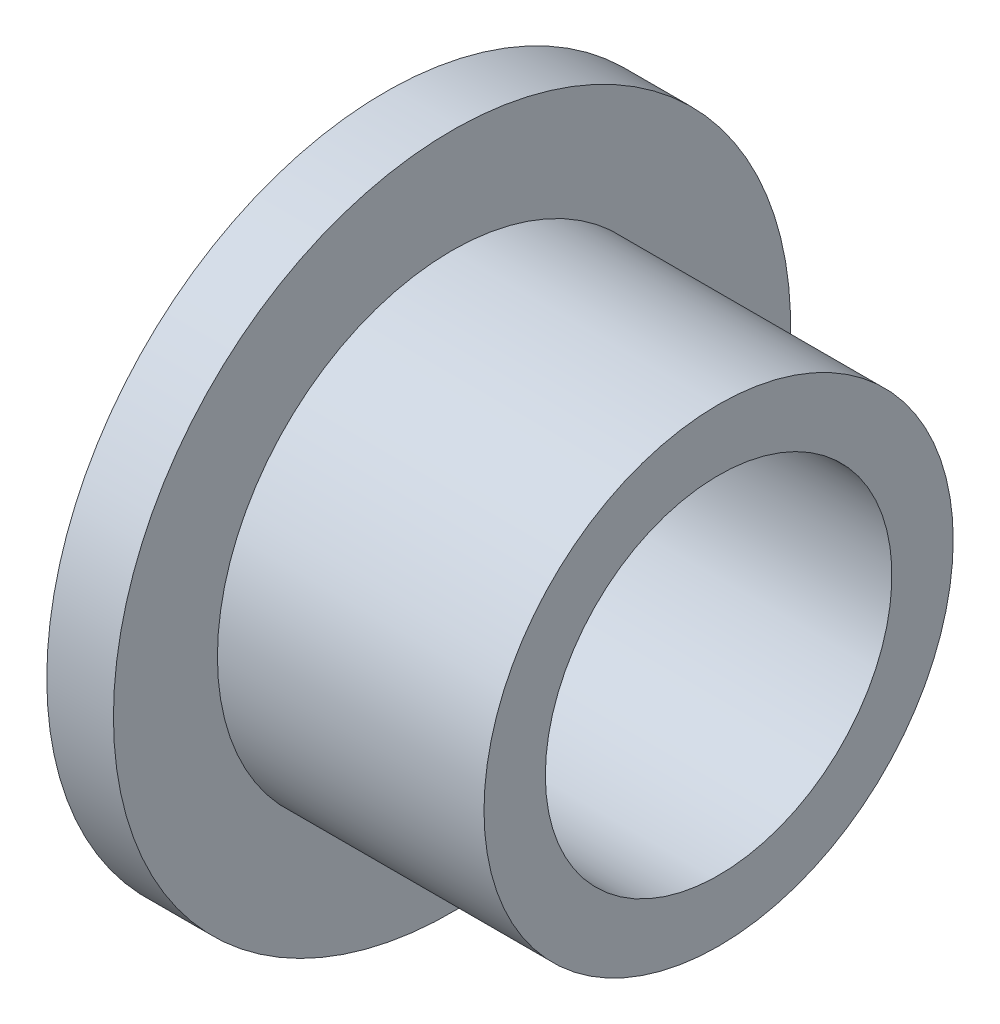
ISO-10303-21;
HEADER;
FILE_DESCRIPTION(('STEP AP214'),'2;1');
FILE_NAME('part.step','',(''),(''),'','','');
FILE_SCHEMA(('AUTOMOTIVE_DESIGN { 1 0 10303 214 1 1 1 1 }'));
ENDSEC;
DATA;
#1=APPLICATION_CONTEXT('core data for automotive mechanical design processes');
#2=APPLICATION_PROTOCOL_DEFINITION('international standard','automotive_design',2000,#1);
#3=PRODUCT_CONTEXT('',#1,'mechanical');
#4=PRODUCT('Part','Part','',(#3));
#5=PRODUCT_RELATED_PRODUCT_CATEGORY('part','',(#4));
#6=PRODUCT_DEFINITION_FORMATION('','',#4);
#7=PRODUCT_DEFINITION_CONTEXT('part definition',#1,'design');
#8=PRODUCT_DEFINITION('design','',#6,#7);
#9=PRODUCT_DEFINITION_SHAPE('','',#8);
#10=(LENGTH_UNIT() NAMED_UNIT(*) SI_UNIT(.MILLI.,.METRE.));
#11=(NAMED_UNIT(*) PLANE_ANGLE_UNIT() SI_UNIT($,.RADIAN.));
#12=(NAMED_UNIT(*) SI_UNIT($,.STERADIAN.) SOLID_ANGLE_UNIT());
#13=UNCERTAINTY_MEASURE_WITH_UNIT(LENGTH_MEASURE(1.E-05),#10,'distance_accuracy_value','');
#14=(GEOMETRIC_REPRESENTATION_CONTEXT(3) GLOBAL_UNCERTAINTY_ASSIGNED_CONTEXT((#13)) GLOBAL_UNIT_ASSIGNED_CONTEXT((#10,
#11,#12)) REPRESENTATION_CONTEXT('',''));
#15=CARTESIAN_POINT('',(0.,0.,0.));
#16=DIRECTION('',(0.,0.,1.));
#17=DIRECTION('',(1.,0.,0.));
#18=AXIS2_PLACEMENT_3D('',#15,#16,#17);
#19=CARTESIAN_POINT('',(-2.57532768734378,0.,0.));
#20=DIRECTION('',(-1.,0.,0.));
#21=DIRECTION('',(0.,0.,1.));
#22=AXIS2_PLACEMENT_3D('',#19,#20,#21);
#23=CYLINDRICAL_SURFACE('',#22,2.70605326876513);
#24=CARTESIAN_POINT('',(-2.57532768734378,0.,0.));
#25=DIRECTION('',(-1.,0.,0.));
#26=DIRECTION('',(0.,0.,1.));
#27=AXIS2_PLACEMENT_3D('',#24,#25,#26);
#28=CIRCLE('',#27,2.70605326876513);
#29=CARTESIAN_POINT('',(-2.57532768734378,0.,2.70605326876513));
#30=VERTEX_POINT('',#29);
#31=EDGE_CURVE('E10',#30,#30,#28,.T.);
#32=ORIENTED_EDGE('',*,*,#31,.T.);
#33=EDGE_LOOP('',(#32));
#34=FACE_BOUND('',#33,.T.);
#35=CARTESIAN_POINT('',(-5.65038822003143,0.,0.));
#36=DIRECTION('',(-1.,0.,0.));
#37=DIRECTION('',(0.,0.,1.));
#38=AXIS2_PLACEMENT_3D('',#35,#36,#37);
#39=CIRCLE('',#38,2.70605326876513);
#40=CARTESIAN_POINT('',(-5.65038822003143,0.,2.70605326876513));
#41=VERTEX_POINT('',#40);
#42=EDGE_CURVE('E57',#41,#41,#39,.T.);
#43=ORIENTED_EDGE('',*,*,#42,.F.);
#44=EDGE_LOOP('',(#43));
#45=FACE_BOUND('',#44,.T.);
#46=ADVANCED_FACE('F35',(#34,#45),#23,.T.);
#47=CARTESIAN_POINT('',(-2.57532768734378,2.70605326876513,0.));
#48=DIRECTION('',(1.,0.,0.));
#49=DIRECTION('',(0.,0.,-1.));
#50=AXIS2_PLACEMENT_3D('',#47,#48,#49);
#51=PLANE('',#50);
#52=CARTESIAN_POINT('',(-2.57532768734378,0.,0.));
#53=DIRECTION('',(-1.,0.,0.));
#54=DIRECTION('',(0.,0.,1.));
#55=AXIS2_PLACEMENT_3D('',#52,#53,#54);
#56=CIRCLE('',#55,1.99878934624697);
#57=CARTESIAN_POINT('',(-2.57532768734378,0.,1.99878934624697));
#58=VERTEX_POINT('',#57);
#59=EDGE_CURVE('E41',#58,#58,#56,.T.);
#60=ORIENTED_EDGE('',*,*,#59,.T.);
#61=EDGE_LOOP('',(#60));
#62=FACE_BOUND('',#61,.T.);
#63=ORIENTED_EDGE('',*,*,#31,.F.);
#64=EDGE_LOOP('',(#63));
#65=FACE_BOUND('',#64,.T.);
#66=ADVANCED_FACE('F65',(#62,#65),#51,.T.);
#67=CARTESIAN_POINT('',(-2.57532768734378,0.,0.));
#68=DIRECTION('',(-1.,0.,0.));
#69=DIRECTION('',(0.,0.,1.));
#70=AXIS2_PLACEMENT_3D('',#67,#68,#69);
#71=CYLINDRICAL_SURFACE('',#70,1.99878934624697);
#72=CARTESIAN_POINT('',(-6.41915335320334,0.,0.));
#73=DIRECTION('',(-1.,0.,0.));
#74=DIRECTION('',(0.,0.,1.));
#75=AXIS2_PLACEMENT_3D('',#72,#73,#74);
#76=CIRCLE('',#75,1.99878934624697);
#77=CARTESIAN_POINT('',(-6.41915335320334,0.,1.99878934624697));
#78=VERTEX_POINT('',#77);
#79=EDGE_CURVE('E45',#78,#78,#76,.T.);
#80=ORIENTED_EDGE('',*,*,#79,.T.);
#81=EDGE_LOOP('',(#80));
#82=FACE_BOUND('',#81,.T.);
#83=ORIENTED_EDGE('',*,*,#59,.F.);
#84=EDGE_LOOP('',(#83));
#85=FACE_BOUND('',#84,.T.);
#86=ADVANCED_FACE('F69',(#82,#85),#71,.F.);
#87=CARTESIAN_POINT('',(-6.41915335320334,1.99878934624697,0.));
#88=DIRECTION('',(-1.,0.,0.));
#89=DIRECTION('',(0.,0.,1.));
#90=AXIS2_PLACEMENT_3D('',#87,#88,#89);
#91=PLANE('',#90);
#92=CARTESIAN_POINT('',(-6.41915335320334,0.,0.));
#93=DIRECTION('',(-1.,0.,0.));
#94=DIRECTION('',(0.,0.,1.));
#95=AXIS2_PLACEMENT_3D('',#92,#93,#94);
#96=CIRCLE('',#95,3.90532687651332);
#97=CARTESIAN_POINT('',(-6.41915335320334,0.,3.90532687651332));
#98=VERTEX_POINT('',#97);
#99=EDGE_CURVE('E49',#98,#98,#96,.T.);
#100=ORIENTED_EDGE('',*,*,#99,.T.);
#101=EDGE_LOOP('',(#100));
#102=FACE_BOUND('',#101,.T.);
#103=ORIENTED_EDGE('',*,*,#79,.F.);
#104=EDGE_LOOP('',(#103));
#105=FACE_BOUND('',#104,.T.);
#106=ADVANCED_FACE('F73',(#102,#105),#91,.T.);
#107=CARTESIAN_POINT('',(-2.57532768734378,0.,0.));
#108=DIRECTION('',(-1.,0.,0.));
#109=DIRECTION('',(0.,0.,1.));
#110=AXIS2_PLACEMENT_3D('',#107,#108,#109);
#111=CYLINDRICAL_SURFACE('',#110,3.90532687651332);
#112=CARTESIAN_POINT('',(-5.65038822003143,0.,0.));
#113=DIRECTION('',(-1.,0.,0.));
#114=DIRECTION('',(0.,0.,1.));
#115=AXIS2_PLACEMENT_3D('',#112,#113,#114);
#116=CIRCLE('',#115,3.90532687651332);
#117=CARTESIAN_POINT('',(-5.65038822003143,0.,3.90532687651332));
#118=VERTEX_POINT('',#117);
#119=EDGE_CURVE('E54',#118,#118,#116,.T.);
#120=ORIENTED_EDGE('',*,*,#119,.T.);
#121=EDGE_LOOP('',(#120));
#122=FACE_BOUND('',#121,.T.);
#123=ORIENTED_EDGE('',*,*,#99,.F.);
#124=EDGE_LOOP('',(#123));
#125=FACE_BOUND('',#124,.T.);
#126=ADVANCED_FACE('F80',(#122,#125),#111,.T.);
#127=CARTESIAN_POINT('',(-5.65038822003143,3.90532687651332,0.));
#128=DIRECTION('',(1.,0.,0.));
#129=DIRECTION('',(0.,0.,-1.));
#130=AXIS2_PLACEMENT_3D('',#127,#128,#129);
#131=PLANE('',#130);
#132=ORIENTED_EDGE('',*,*,#42,.T.);
#133=EDGE_LOOP('',(#132));
#134=FACE_BOUND('',#133,.T.);
#135=ORIENTED_EDGE('',*,*,#119,.F.);
#136=EDGE_LOOP('',(#135));
#137=FACE_BOUND('',#136,.T.);
#138=ADVANCED_FACE('F61',(#134,#137),#131,.T.);
#139=CLOSED_SHELL('',(#46,#66,#86,#106,#126,#138));
#140=MANIFOLD_SOLID_BREP('B2',#139);
#141=ADVANCED_BREP_SHAPE_REPRESENTATION('',(#18,#140),#14);
#142=SHAPE_DEFINITION_REPRESENTATION(#9,#141);
ENDSEC;
END-ISO-10303-21;
